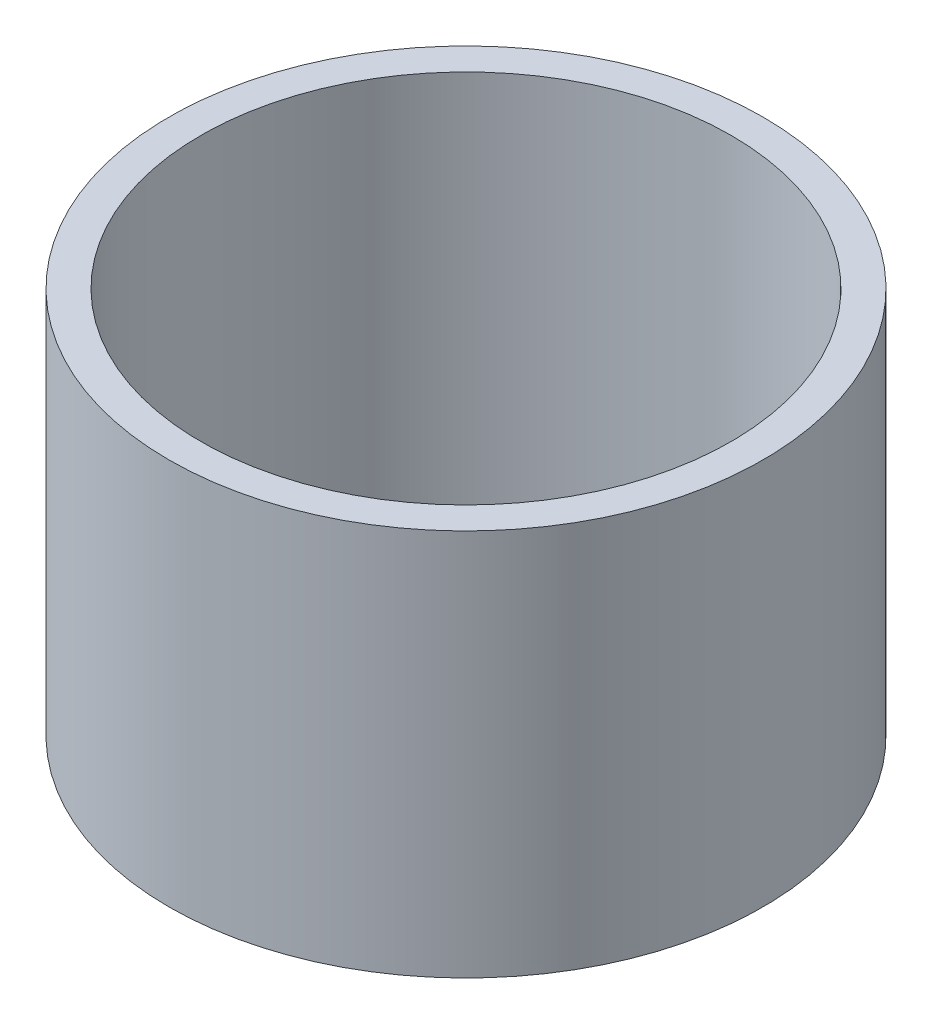
ISO-10303-21;
HEADER;
FILE_DESCRIPTION(('STEP AP214'),'2;1');
FILE_NAME('part.step','',(''),(''),'','','');
FILE_SCHEMA(('AUTOMOTIVE_DESIGN { 1 0 10303 214 1 1 1 1 }'));
ENDSEC;
DATA;
#1=APPLICATION_CONTEXT('core data for automotive mechanical design processes');
#2=APPLICATION_PROTOCOL_DEFINITION('international standard','automotive_design',2000,#1);
#3=PRODUCT_CONTEXT('',#1,'mechanical');
#4=PRODUCT('Part','Part','',(#3));
#5=PRODUCT_RELATED_PRODUCT_CATEGORY('part','',(#4));
#6=PRODUCT_DEFINITION_FORMATION('','',#4);
#7=PRODUCT_DEFINITION_CONTEXT('part definition',#1,'design');
#8=PRODUCT_DEFINITION('design','',#6,#7);
#9=PRODUCT_DEFINITION_SHAPE('','',#8);
#10=(LENGTH_UNIT() NAMED_UNIT(*) SI_UNIT(.MILLI.,.METRE.));
#11=(NAMED_UNIT(*) PLANE_ANGLE_UNIT() SI_UNIT($,.RADIAN.));
#12=(NAMED_UNIT(*) SI_UNIT($,.STERADIAN.) SOLID_ANGLE_UNIT());
#13=UNCERTAINTY_MEASURE_WITH_UNIT(LENGTH_MEASURE(1.E-05),#10,'distance_accuracy_value','');
#14=(GEOMETRIC_REPRESENTATION_CONTEXT(3) GLOBAL_UNCERTAINTY_ASSIGNED_CONTEXT((#13)) GLOBAL_UNIT_ASSIGNED_CONTEXT((#10,
#11,#12)) REPRESENTATION_CONTEXT('',''));
#15=CARTESIAN_POINT('',(0.,0.,0.));
#16=DIRECTION('',(0.,0.,1.));
#17=DIRECTION('',(1.,0.,0.));
#18=AXIS2_PLACEMENT_3D('',#15,#16,#17);
#19=CARTESIAN_POINT('',(0.,-8.95261686063012,0.));
#20=DIRECTION('',(0.,-1.,0.));
#21=DIRECTION('',(0.,0.,-1.));
#22=AXIS2_PLACEMENT_3D('',#19,#20,#21);
#23=CYLINDRICAL_SURFACE('',#22,14.);
#24=CARTESIAN_POINT('',(0.,-18.25,0.));
#25=DIRECTION('',(0.,-1.,0.));
#26=DIRECTION('',(0.,0.,-1.));
#27=AXIS2_PLACEMENT_3D('',#24,#25,#26);
#28=CIRCLE('',#27,14.);
#29=CARTESIAN_POINT('',(0.,-18.25,-14.));
#30=VERTEX_POINT('',#29);
#31=EDGE_CURVE('E47',#30,#30,#28,.T.);
#32=ORIENTED_EDGE('',*,*,#31,.F.);
#33=EDGE_LOOP('',(#32));
#34=FACE_BOUND('',#33,.T.);
#35=CARTESIAN_POINT('',(0.,0.,0.));
#36=DIRECTION('',(0.,-1.,0.));
#37=DIRECTION('',(0.,0.,-1.));
#38=AXIS2_PLACEMENT_3D('',#35,#36,#37);
#39=CIRCLE('',#38,14.);
#40=CARTESIAN_POINT('',(0.,0.,-14.));
#41=VERTEX_POINT('',#40);
#42=EDGE_CURVE('E10',#41,#41,#39,.T.);
#43=ORIENTED_EDGE('',*,*,#42,.T.);
#44=EDGE_LOOP('',(#43));
#45=FACE_BOUND('',#44,.T.);
#46=ADVANCED_FACE('F33',(#34,#45),#23,.T.);
#47=CARTESIAN_POINT('',(-14.,0.,0.));
#48=DIRECTION('',(0.,-1.,0.));
#49=DIRECTION('',(0.,0.,-1.));
#50=AXIS2_PLACEMENT_3D('',#47,#48,#49);
#51=PLANE('',#50);
#52=ORIENTED_EDGE('',*,*,#42,.F.);
#53=EDGE_LOOP('',(#52));
#54=FACE_BOUND('',#53,.T.);
#55=CARTESIAN_POINT('',(0.,0.,0.));
#56=DIRECTION('',(0.,-1.,0.));
#57=DIRECTION('',(0.,0.,-1.));
#58=AXIS2_PLACEMENT_3D('',#55,#56,#57);
#59=CIRCLE('',#58,12.5);
#60=CARTESIAN_POINT('',(0.,0.,-12.5));
#61=VERTEX_POINT('',#60);
#62=EDGE_CURVE('E39',#61,#61,#59,.T.);
#63=ORIENTED_EDGE('',*,*,#62,.T.);
#64=EDGE_LOOP('',(#63));
#65=FACE_BOUND('',#64,.T.);
#66=ADVANCED_FACE('F56',(#54,#65),#51,.F.);
#67=CARTESIAN_POINT('',(0.,-8.95261686063012,0.));
#68=DIRECTION('',(0.,-1.,0.));
#69=DIRECTION('',(0.,0.,-1.));
#70=AXIS2_PLACEMENT_3D('',#67,#68,#69);
#71=CYLINDRICAL_SURFACE('',#70,12.5);
#72=ORIENTED_EDGE('',*,*,#62,.F.);
#73=EDGE_LOOP('',(#72));
#74=FACE_BOUND('',#73,.T.);
#75=CARTESIAN_POINT('',(0.,-18.25,0.));
#76=DIRECTION('',(0.,-1.,0.));
#77=DIRECTION('',(0.,0.,-1.));
#78=AXIS2_PLACEMENT_3D('',#75,#76,#77);
#79=CIRCLE('',#78,12.5);
#80=CARTESIAN_POINT('',(0.,-18.25,-12.5));
#81=VERTEX_POINT('',#80);
#82=EDGE_CURVE('E43',#81,#81,#79,.T.);
#83=ORIENTED_EDGE('',*,*,#82,.T.);
#84=EDGE_LOOP('',(#83));
#85=FACE_BOUND('',#84,.T.);
#86=ADVANCED_FACE('F60',(#74,#85),#71,.F.);
#87=CARTESIAN_POINT('',(-12.5,-18.25,0.));
#88=DIRECTION('',(0.,1.,0.));
#89=DIRECTION('',(0.,0.,1.));
#90=AXIS2_PLACEMENT_3D('',#87,#88,#89);
#91=PLANE('',#90);
#92=ORIENTED_EDGE('',*,*,#82,.F.);
#93=EDGE_LOOP('',(#92));
#94=FACE_BOUND('',#93,.T.);
#95=ORIENTED_EDGE('',*,*,#31,.T.);
#96=EDGE_LOOP('',(#95));
#97=FACE_BOUND('',#96,.T.);
#98=ADVANCED_FACE('F53',(#94,#97),#91,.F.);
#99=CLOSED_SHELL('',(#46,#66,#86,#98));
#100=MANIFOLD_SOLID_BREP('B2',#99);
#101=ADVANCED_BREP_SHAPE_REPRESENTATION('',(#18,#100),#14);
#102=SHAPE_DEFINITION_REPRESENTATION(#9,#101);
ENDSEC;
END-ISO-10303-21;
